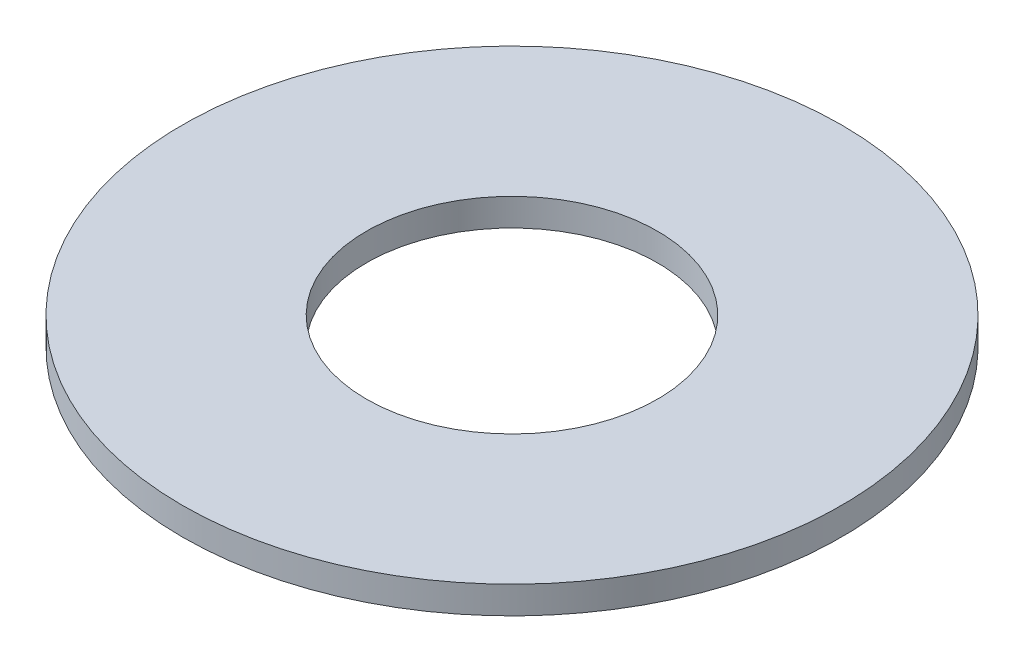
ISO-10303-21;
HEADER;
FILE_DESCRIPTION(('STEP AP214'),'2;1');
FILE_NAME('part.step','',(''),(''),'','','');
FILE_SCHEMA(('AUTOMOTIVE_DESIGN { 1 0 10303 214 1 1 1 1 }'));
ENDSEC;
DATA;
#1=APPLICATION_CONTEXT('core data for automotive mechanical design processes');
#2=APPLICATION_PROTOCOL_DEFINITION('international standard','automotive_design',2000,#1);
#3=PRODUCT_CONTEXT('',#1,'mechanical');
#4=PRODUCT('Part','Part','',(#3));
#5=PRODUCT_RELATED_PRODUCT_CATEGORY('part','',(#4));
#6=PRODUCT_DEFINITION_FORMATION('','',#4);
#7=PRODUCT_DEFINITION_CONTEXT('part definition',#1,'design');
#8=PRODUCT_DEFINITION('design','',#6,#7);
#9=PRODUCT_DEFINITION_SHAPE('','',#8);
#10=(LENGTH_UNIT() NAMED_UNIT(*) SI_UNIT(.MILLI.,.METRE.));
#11=(NAMED_UNIT(*) PLANE_ANGLE_UNIT() SI_UNIT($,.RADIAN.));
#12=(NAMED_UNIT(*) SI_UNIT($,.STERADIAN.) SOLID_ANGLE_UNIT());
#13=UNCERTAINTY_MEASURE_WITH_UNIT(LENGTH_MEASURE(1.E-05),#10,'distance_accuracy_value','');
#14=(GEOMETRIC_REPRESENTATION_CONTEXT(3) GLOBAL_UNCERTAINTY_ASSIGNED_CONTEXT((#13)) GLOBAL_UNIT_ASSIGNED_CONTEXT((#10,
#11,#12)) REPRESENTATION_CONTEXT('',''));
#15=CARTESIAN_POINT('',(0.,0.,0.));
#16=DIRECTION('',(0.,0.,1.));
#17=DIRECTION('',(1.,0.,0.));
#18=AXIS2_PLACEMENT_3D('',#15,#16,#17);
#19=CARTESIAN_POINT('',(0.,0.5,0.));
#20=DIRECTION('',(0.,1.,0.));
#21=DIRECTION('',(0.,0.,1.));
#22=AXIS2_PLACEMENT_3D('',#19,#20,#21);
#23=PLANE('',#22);
#24=CARTESIAN_POINT('',(0.,0.5,0.));
#25=DIRECTION('',(0.,1.,0.));
#26=DIRECTION('',(0.,0.,1.));
#27=AXIS2_PLACEMENT_3D('',#24,#25,#26);
#28=CIRCLE('',#27,6.);
#29=CARTESIAN_POINT('',(0.,0.5,6.));
#30=VERTEX_POINT('',#29);
#31=EDGE_CURVE('E10',#30,#30,#28,.T.);
#32=ORIENTED_EDGE('',*,*,#31,.T.);
#33=EDGE_LOOP('',(#32));
#34=FACE_BOUND('',#33,.T.);
#35=CARTESIAN_POINT('',(0.,0.5,0.));
#36=DIRECTION('',(0.,1.,0.));
#37=DIRECTION('',(0.,0.,1.));
#38=AXIS2_PLACEMENT_3D('',#35,#36,#37);
#39=CIRCLE('',#38,2.65);
#40=CARTESIAN_POINT('',(0.,0.5,2.65));
#41=VERTEX_POINT('',#40);
#42=EDGE_CURVE('E54',#41,#41,#39,.T.);
#43=ORIENTED_EDGE('',*,*,#42,.F.);
#44=EDGE_LOOP('',(#43));
#45=FACE_BOUND('',#44,.T.);
#46=ADVANCED_FACE('F41',(#34,#45),#23,.T.);
#47=CARTESIAN_POINT('',(0.,0.,0.));
#48=DIRECTION('',(0.,1.,0.));
#49=DIRECTION('',(0.,0.,1.));
#50=AXIS2_PLACEMENT_3D('',#47,#48,#49);
#51=PLANE('',#50);
#52=CARTESIAN_POINT('',(0.,0.,0.));
#53=DIRECTION('',(0.,1.,0.));
#54=DIRECTION('',(0.,0.,1.));
#55=AXIS2_PLACEMENT_3D('',#52,#53,#54);
#56=CIRCLE('',#55,6.);
#57=CARTESIAN_POINT('',(0.,0.,6.));
#58=VERTEX_POINT('',#57);
#59=EDGE_CURVE('E45',#58,#58,#56,.T.);
#60=ORIENTED_EDGE('',*,*,#59,.F.);
#61=EDGE_LOOP('',(#60));
#62=FACE_BOUND('',#61,.T.);
#63=CARTESIAN_POINT('',(0.,0.,0.));
#64=DIRECTION('',(0.,1.,0.));
#65=DIRECTION('',(0.,0.,1.));
#66=AXIS2_PLACEMENT_3D('',#63,#64,#65);
#67=CIRCLE('',#66,2.65);
#68=CARTESIAN_POINT('',(0.,0.,2.65));
#69=VERTEX_POINT('',#68);
#70=EDGE_CURVE('E56',#69,#69,#67,.T.);
#71=ORIENTED_EDGE('',*,*,#70,.T.);
#72=EDGE_LOOP('',(#71));
#73=FACE_BOUND('',#72,.T.);
#74=ADVANCED_FACE('F68',(#62,#73),#51,.F.);
#75=CARTESIAN_POINT('',(0.,0.5,0.));
#76=DIRECTION('',(0.,-1.,0.));
#77=DIRECTION('',(0.,0.,-1.));
#78=AXIS2_PLACEMENT_3D('',#75,#76,#77);
#79=CYLINDRICAL_SURFACE('',#78,6.);
#80=ORIENTED_EDGE('',*,*,#31,.F.);
#81=EDGE_LOOP('',(#80));
#82=FACE_BOUND('',#81,.T.);
#83=ORIENTED_EDGE('',*,*,#59,.T.);
#84=EDGE_LOOP('',(#83));
#85=FACE_BOUND('',#84,.T.);
#86=ADVANCED_FACE('F43',(#82,#85),#79,.T.);
#87=CARTESIAN_POINT('',(0.,0.5,0.));
#88=DIRECTION('',(0.,-1.,0.));
#89=DIRECTION('',(0.,0.,-1.));
#90=AXIS2_PLACEMENT_3D('',#87,#88,#89);
#91=CYLINDRICAL_SURFACE('',#90,2.65);
#92=ORIENTED_EDGE('',*,*,#42,.T.);
#93=EDGE_LOOP('',(#92));
#94=FACE_BOUND('',#93,.T.);
#95=ORIENTED_EDGE('',*,*,#70,.F.);
#96=EDGE_LOOP('',(#95));
#97=FACE_BOUND('',#96,.T.);
#98=ADVANCED_FACE('F64',(#94,#97),#91,.F.);
#99=CLOSED_SHELL('',(#46,#74,#86,#98));
#100=MANIFOLD_SOLID_BREP('B2',#99);
#101=ADVANCED_BREP_SHAPE_REPRESENTATION('',(#18,#100),#14);
#102=SHAPE_DEFINITION_REPRESENTATION(#9,#101);
ENDSEC;
END-ISO-10303-21;
